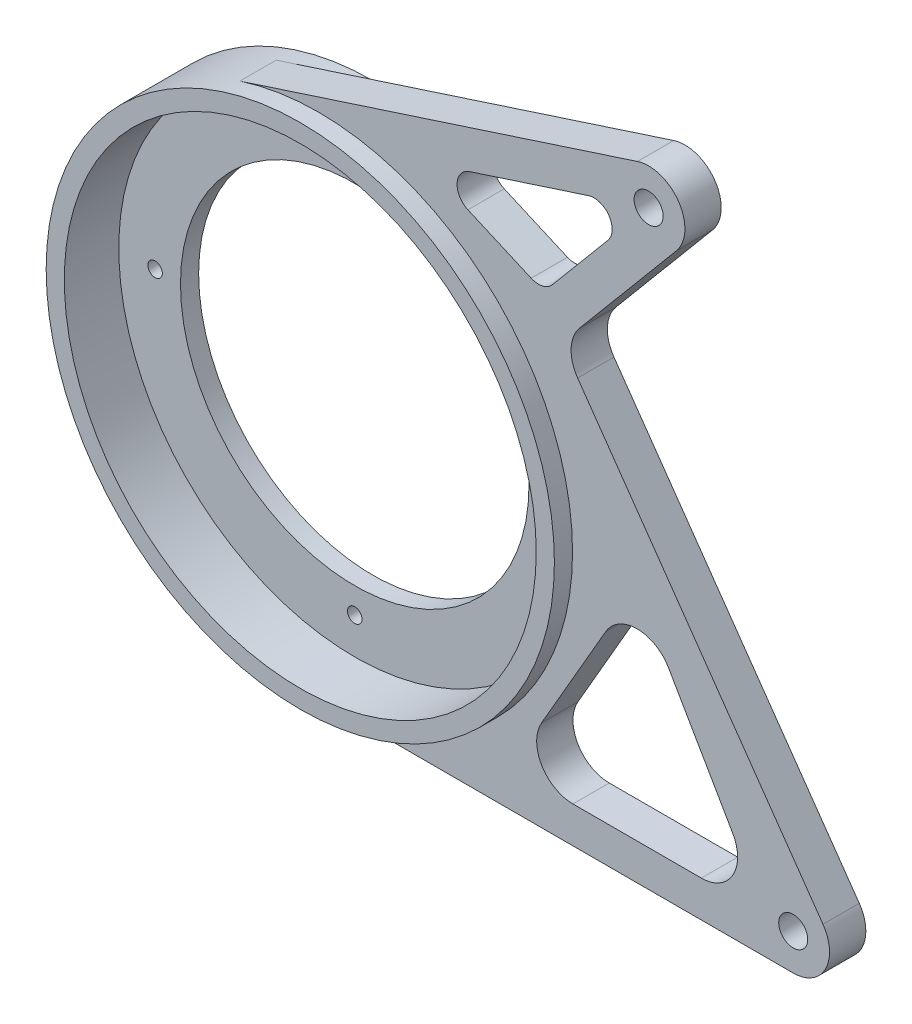
ISO-10303-21;
HEADER;
FILE_DESCRIPTION(('STEP AP214'),'2;1');
FILE_NAME('part.step','',(''),(''),'','','');
FILE_SCHEMA(('AUTOMOTIVE_DESIGN { 1 0 10303 214 1 1 1 1 }'));
ENDSEC;
DATA;
#1=APPLICATION_CONTEXT('core data for automotive mechanical design processes');
#2=APPLICATION_PROTOCOL_DEFINITION('international standard','automotive_design',2000,#1);
#3=PRODUCT_CONTEXT('',#1,'mechanical');
#4=PRODUCT('Part','Part','',(#3));
#5=PRODUCT_RELATED_PRODUCT_CATEGORY('part','',(#4));
#6=PRODUCT_DEFINITION_FORMATION('','',#4);
#7=PRODUCT_DEFINITION_CONTEXT('part definition',#1,'design');
#8=PRODUCT_DEFINITION('design','',#6,#7);
#9=PRODUCT_DEFINITION_SHAPE('','',#8);
#10=(LENGTH_UNIT() NAMED_UNIT(*) SI_UNIT(.MILLI.,.METRE.));
#11=(NAMED_UNIT(*) PLANE_ANGLE_UNIT() SI_UNIT($,.RADIAN.));
#12=(NAMED_UNIT(*) SI_UNIT($,.STERADIAN.) SOLID_ANGLE_UNIT());
#13=UNCERTAINTY_MEASURE_WITH_UNIT(LENGTH_MEASURE(1.E-05),#10,'distance_accuracy_value','');
#14=(GEOMETRIC_REPRESENTATION_CONTEXT(3) GLOBAL_UNCERTAINTY_ASSIGNED_CONTEXT((#13)) GLOBAL_UNIT_ASSIGNED_CONTEXT((#10,
#11,#12)) REPRESENTATION_CONTEXT('',''));
#15=CARTESIAN_POINT('',(0.,0.,0.));
#16=DIRECTION('',(0.,0.,1.));
#17=DIRECTION('',(1.,0.,0.));
#18=AXIS2_PLACEMENT_3D('',#15,#16,#17);
#19=CARTESIAN_POINT('',(15.4162789410525,-12.9357939735634,20.));
#20=DIRECTION('',(0.766044443118974,-0.642787609686544,0.));
#21=DIRECTION('',(0.642787609686544,0.766044443118974,0.));
#22=AXIS2_PLACEMENT_3D('',#19,#20,#21);
#23=PLANE('',#22);
#24=DIRECTION('',(0.,0.,-1.));
#25=VECTOR('',#24,1.);
#26=CARTESIAN_POINT('',(71.9311352964435,54.4159891229186,20.));
#27=LINE('',#26,#25);
#28=CARTESIAN_POINT('',(71.9311352964435,54.4159891229186,15.));
#29=VERTEX_POINT('',#28);
#30=CARTESIAN_POINT('',(71.9311352964435,54.4159891229186,5.));
#31=VERTEX_POINT('',#30);
#32=EDGE_CURVE('E229',#29,#31,#27,.T.);
#33=ORIENTED_EDGE('',*,*,#32,.T.);
#34=DIRECTION('',(0.642787609686544,0.766044443118974,0.));
#35=VECTOR('',#34,1.);
#36=CARTESIAN_POINT('',(15.4162789410525,-12.9357939735634,5.));
#37=LINE('',#36,#35);
#38=CARTESIAN_POINT('',(98.6106198945981,86.2113607413309,5.));
#39=VERTEX_POINT('',#38);
#40=EDGE_CURVE('E702',#31,#39,#37,.T.);
#41=ORIENTED_EDGE('',*,*,#40,.T.);
#42=DIRECTION('',(0.,0.,-1.));
#43=VECTOR('',#42,1.);
#44=CARTESIAN_POINT('',(98.6106198945981,86.2113607413309,20.));
#45=LINE('',#44,#43);
#46=CARTESIAN_POINT('',(98.6106198945981,86.2113607413309,15.));
#47=VERTEX_POINT('',#46);
#48=EDGE_CURVE('E206',#47,#39,#45,.T.);
#49=ORIENTED_EDGE('',*,*,#48,.F.);
#50=DIRECTION('',(-0.642787609686544,-0.766044443118974,0.));
#51=VECTOR('',#50,1.);
#52=CARTESIAN_POINT('',(15.4162789410525,-12.9357939735634,15.));
#53=LINE('',#52,#51);
#54=EDGE_CURVE('E655',#47,#29,#53,.T.);
#55=ORIENTED_EDGE('',*,*,#54,.T.);
#56=EDGE_LOOP('',(#33,#41,#49,#55));
#57=FACE_BOUND('',#56,.T.);
#58=ADVANCED_FACE('F35',(#57),#23,.T.);
#59=CARTESIAN_POINT('',(90.9501754634083,92.6392368381963,20.));
#60=DIRECTION('',(0.,0.,-1.));
#61=DIRECTION('',(-1.,0.,0.));
#62=AXIS2_PLACEMENT_3D('',#59,#60,#61);
#63=CYLINDRICAL_SURFACE('',#62,10.);
#64=CARTESIAN_POINT('',(90.9501754634083,92.6392368381963,5.));
#65=DIRECTION('',(0.,0.,-1.));
#66=DIRECTION('',(-1.,0.,0.));
#67=AXIS2_PLACEMENT_3D('',#64,#65,#66);
#68=CIRCLE('',#67,10.);
#69=CARTESIAN_POINT('',(87.8600055196588,102.149802001148,5.));
#70=VERTEX_POINT('',#69);
#71=EDGE_CURVE('E705',#70,#39,#68,.T.);
#72=ORIENTED_EDGE('',*,*,#71,.F.);
#73=DIRECTION('',(0.,0.,-1.));
#74=VECTOR('',#73,1.);
#75=CARTESIAN_POINT('',(87.8600055196588,102.149802001148,20.));
#76=LINE('',#75,#74);
#77=CARTESIAN_POINT('',(87.8600055196588,102.149802001148,15.));
#78=VERTEX_POINT('',#77);
#79=EDGE_CURVE('E198',#78,#70,#76,.T.);
#80=ORIENTED_EDGE('',*,*,#79,.F.);
#81=CARTESIAN_POINT('',(90.9501754634083,92.6392368381963,15.));
#82=DIRECTION('',(0.,0.,1.));
#83=DIRECTION('',(1.,0.,0.));
#84=AXIS2_PLACEMENT_3D('',#81,#82,#83);
#85=CIRCLE('',#84,10.);
#86=EDGE_CURVE('E651',#47,#78,#85,.T.);
#87=ORIENTED_EDGE('',*,*,#86,.F.);
#88=ORIENTED_EDGE('',*,*,#48,.T.);
#89=EDGE_LOOP('',(#72,#80,#87,#88));
#90=FACE_BOUND('',#89,.T.);
#91=ADVANCED_FACE('F311',(#90),#63,.T.);
#92=CARTESIAN_POINT('',(-21.6311896062464,66.5739561406608,20.));
#93=DIRECTION('',(-0.309016994374948,0.951056516295153,0.));
#94=DIRECTION('',(-0.951056516295153,-0.309016994374948,0.));
#95=AXIS2_PLACEMENT_3D('',#92,#93,#94);
#96=PLANE('',#95);
#97=ORIENTED_EDGE('',*,*,#79,.T.);
#98=DIRECTION('',(-0.951056516295153,-0.309016994374948,0.));
#99=VECTOR('',#98,1.);
#100=CARTESIAN_POINT('',(-21.6311896062464,66.5739561406608,5.));
#101=LINE('',#100,#99);
#102=CARTESIAN_POINT('',(-21.6311896062464,66.5739561406608,5.));
#103=VERTEX_POINT('',#102);
#104=EDGE_CURVE('E639',#70,#103,#101,.T.);
#105=ORIENTED_EDGE('',*,*,#104,.T.);
#106=DIRECTION('',(0.,0.,-1.));
#107=VECTOR('',#106,1.);
#108=CARTESIAN_POINT('',(-21.6311896062464,66.5739561406608,20.));
#109=LINE('',#108,#107);
#110=CARTESIAN_POINT('',(-21.6311896062464,66.5739561406608,15.));
#111=VERTEX_POINT('',#110);
#112=EDGE_CURVE('E191',#111,#103,#109,.T.);
#113=ORIENTED_EDGE('',*,*,#112,.F.);
#114=DIRECTION('',(-0.951056516295153,-0.309016994374949,0.));
#115=VECTOR('',#114,1.);
#116=CARTESIAN_POINT('',(-21.6311896062464,66.5739561406608,15.));
#117=LINE('',#116,#115);
#118=EDGE_CURVE('E737',#78,#111,#117,.T.);
#119=ORIENTED_EDGE('',*,*,#118,.F.);
#120=EDGE_LOOP('',(#97,#105,#113,#119));
#121=FACE_BOUND('',#120,.T.);
#122=ADVANCED_FACE('F317',(#121),#96,.T.);
#123=CARTESIAN_POINT('',(0.,-70.,20.));
#124=DIRECTION('',(0.,1.,0.));
#125=DIRECTION('',(0.,0.,1.));
#126=AXIS2_PLACEMENT_3D('',#123,#124,#125);
#127=PLANE('',#126);
#128=DIRECTION('',(-1.,0.,0.));
#129=VECTOR('',#128,1.);
#130=CARTESIAN_POINT('',(0.,-70.,5.));
#131=LINE('',#130,#129);
#132=CARTESIAN_POINT('',(130.790178730288,-70.,5.));
#133=VERTEX_POINT('',#132);
#134=CARTESIAN_POINT('',(0.,-70.,5.));
#135=VERTEX_POINT('',#134);
#136=EDGE_CURVE('E170',#133,#135,#131,.T.);
#137=ORIENTED_EDGE('',*,*,#136,.F.);
#138=DIRECTION('',(0.,0.,-1.));
#139=VECTOR('',#138,1.);
#140=CARTESIAN_POINT('',(130.790178730288,-70.,20.));
#141=LINE('',#140,#139);
#142=CARTESIAN_POINT('',(130.790178730288,-70.,15.));
#143=VERTEX_POINT('',#142);
#144=EDGE_CURVE('E196',#143,#133,#141,.T.);
#145=ORIENTED_EDGE('',*,*,#144,.F.);
#146=DIRECTION('',(1.,0.,0.));
#147=VECTOR('',#146,1.);
#148=CARTESIAN_POINT('',(175.711739026467,-70.,15.));
#149=LINE('',#148,#147);
#150=CARTESIAN_POINT('',(0.,-70.,15.));
#151=VERTEX_POINT('',#150);
#152=EDGE_CURVE('E195',#151,#143,#149,.T.);
#153=ORIENTED_EDGE('',*,*,#152,.F.);
#154=DIRECTION('',(0.,0.,-1.));
#155=VECTOR('',#154,1.);
#156=CARTESIAN_POINT('',(0.,-70.,20.));
#157=LINE('',#156,#155);
#158=EDGE_CURVE('E189',#151,#135,#157,.T.);
#159=ORIENTED_EDGE('',*,*,#158,.T.);
#160=EDGE_LOOP('',(#137,#145,#153,#159));
#161=FACE_BOUND('',#160,.T.);
#162=ADVANCED_FACE('F194',(#161),#127,.F.);
#163=CARTESIAN_POINT('',(130.790178730288,-60.,20.));
#164=DIRECTION('',(0.,0.,-1.));
#165=DIRECTION('',(-1.,0.,0.));
#166=AXIS2_PLACEMENT_3D('',#163,#164,#165);
#167=CYLINDRICAL_SURFACE('',#166,9.99999999999998);
#168=CARTESIAN_POINT('',(130.790178730288,-60.,5.));
#169=DIRECTION('',(0.,0.,-1.));
#170=DIRECTION('',(-1.,0.,0.));
#171=AXIS2_PLACEMENT_3D('',#168,#169,#170);
#172=CIRCLE('',#171,9.99999999999998);
#173=CARTESIAN_POINT('',(138.981699173178,-54.2642356364896,5.));
#174=VERTEX_POINT('',#173);
#175=EDGE_CURVE('E176',#174,#133,#172,.T.);
#176=ORIENTED_EDGE('',*,*,#175,.F.);
#177=DIRECTION('',(0.,0.,-1.));
#178=VECTOR('',#177,1.);
#179=CARTESIAN_POINT('',(138.981699173178,-54.2642356364896,20.));
#180=LINE('',#179,#178);
#181=CARTESIAN_POINT('',(138.981699173178,-54.2642356364896,15.));
#182=VERTEX_POINT('',#181);
#183=EDGE_CURVE('E200',#182,#174,#180,.T.);
#184=ORIENTED_EDGE('',*,*,#183,.F.);
#185=CARTESIAN_POINT('',(130.790178730288,-60.,15.));
#186=DIRECTION('',(0.,0.,1.));
#187=DIRECTION('',(1.,0.,0.));
#188=AXIS2_PLACEMENT_3D('',#185,#186,#187);
#189=CIRCLE('',#188,9.99999999999998);
#190=EDGE_CURVE('E701',#143,#182,#189,.T.);
#191=ORIENTED_EDGE('',*,*,#190,.F.);
#192=ORIENTED_EDGE('',*,*,#144,.T.);
#193=EDGE_LOOP('',(#176,#184,#191,#192));
#194=FACE_BOUND('',#193,.T.);
#195=ADVANCED_FACE('F497',(#194),#167,.T.);
#196=CARTESIAN_POINT('',(67.7622690219187,47.4476515753416,20.));
#197=DIRECTION('',(0.819152044288993,0.573576436351044,0.));
#198=DIRECTION('',(-0.573576436351044,0.819152044288993,0.));
#199=AXIS2_PLACEMENT_3D('',#196,#197,#198);
#200=PLANE('',#199);
#201=ORIENTED_EDGE('',*,*,#183,.T.);
#202=DIRECTION('',(-0.573576436351044,0.819152044288993,0.));
#203=VECTOR('',#202,1.);
#204=CARTESIAN_POINT('',(67.7622690219187,47.4476515753416,5.));
#205=LINE('',#204,#203);
#206=CARTESIAN_POINT('',(71.4000592847433,42.2523486625427,5.));
#207=VERTEX_POINT('',#206);
#208=EDGE_CURVE('E698',#174,#207,#205,.T.);
#209=ORIENTED_EDGE('',*,*,#208,.T.);
#210=DIRECTION('',(0.,0.,-1.));
#211=VECTOR('',#210,1.);
#212=CARTESIAN_POINT('',(71.4000592847433,42.2523486625427,20.));
#213=LINE('',#212,#211);
#214=CARTESIAN_POINT('',(71.4000592847433,42.2523486625427,15.));
#215=VERTEX_POINT('',#214);
#216=EDGE_CURVE('E691',#215,#207,#213,.T.);
#217=ORIENTED_EDGE('',*,*,#216,.F.);
#218=DIRECTION('',(0.573576436351044,-0.819152044288993,0.));
#219=VECTOR('',#218,1.);
#220=CARTESIAN_POINT('',(67.7622690219187,47.4476515753416,15.));
#221=LINE('',#220,#219);
#222=EDGE_CURVE('E699',#215,#182,#221,.T.);
#223=ORIENTED_EDGE('',*,*,#222,.T.);
#224=EDGE_LOOP('',(#201,#209,#217,#223));
#225=FACE_BOUND('',#224,.T.);
#226=ADVANCED_FACE('F356',(#225),#200,.T.);
#227=CARTESIAN_POINT('',(87.7901787302884,-19.3782217350898,20.));
#228=DIRECTION('',(0.,0.,-1.));
#229=DIRECTION('',(-1.,0.,0.));
#230=AXIS2_PLACEMENT_3D('',#227,#228,#229);
#231=CYLINDRICAL_SURFACE('',#230,9.99999999999999);
#232=DIRECTION('',(0.,0.,-1.));
#233=VECTOR('',#232,1.);
#234=CARTESIAN_POINT('',(79.129924692444,-14.3782217350898,20.));
#235=LINE('',#234,#233);
#236=CARTESIAN_POINT('',(79.129924692444,-14.3782217350898,15.));
#237=VERTEX_POINT('',#236);
#238=CARTESIAN_POINT('',(79.129924692444,-14.3782217350898,5.));
#239=VERTEX_POINT('',#238);
#240=EDGE_CURVE('E210',#237,#239,#235,.T.);
#241=ORIENTED_EDGE('',*,*,#240,.T.);
#242=CARTESIAN_POINT('',(87.7901787302884,-19.3782217350898,5.));
#243=DIRECTION('',(0.,0.,-1.));
#244=DIRECTION('',(-1.,0.,0.));
#245=AXIS2_PLACEMENT_3D('',#242,#243,#244);
#246=CIRCLE('',#245,9.99999999999999);
#247=CARTESIAN_POINT('',(96.4504327681327,-14.3782217350898,5.));
#248=VERTEX_POINT('',#247);
#249=EDGE_CURVE('E50',#239,#248,#246,.T.);
#250=ORIENTED_EDGE('',*,*,#249,.T.);
#251=DIRECTION('',(0.,0.,-1.));
#252=VECTOR('',#251,1.);
#253=CARTESIAN_POINT('',(96.4504327681327,-14.3782217350898,20.));
#254=LINE('',#253,#252);
#255=CARTESIAN_POINT('',(96.4504327681327,-14.3782217350898,15.));
#256=VERTEX_POINT('',#255);
#257=EDGE_CURVE('E226',#256,#248,#254,.T.);
#258=ORIENTED_EDGE('',*,*,#257,.F.);
#259=CARTESIAN_POINT('',(87.7901787302884,-19.3782217350898,15.));
#260=DIRECTION('',(0.,0.,1.));
#261=DIRECTION('',(1.,0.,0.));
#262=AXIS2_PLACEMENT_3D('',#259,#260,#261);
#263=CIRCLE('',#262,9.99999999999999);
#264=EDGE_CURVE('E682',#256,#237,#263,.T.);
#265=ORIENTED_EDGE('',*,*,#264,.T.);
#266=EDGE_LOOP('',(#241,#250,#258,#265));
#267=FACE_BOUND('',#266,.T.);
#268=ADVANCED_FACE('F352',(#267),#231,.F.);
#269=CARTESIAN_POINT('',(66.1118719341824,38.1697070578307,20.));
#270=DIRECTION('',(-0.866025403784436,-0.500000000000004,0.));
#271=DIRECTION('',(0.500000000000004,-0.866025403784436,0.));
#272=AXIS2_PLACEMENT_3D('',#269,#270,#271);
#273=PLANE('',#272);
#274=ORIENTED_EDGE('',*,*,#257,.T.);
#275=DIRECTION('',(0.500000000000004,-0.866025403784436,0.));
#276=VECTOR('',#275,1.);
#277=CARTESIAN_POINT('',(66.1118719341824,38.1697070578307,5.));
#278=LINE('',#277,#276);
#279=CARTESIAN_POINT('',(114.129924692444,-45.,5.));
#280=VERTEX_POINT('',#279);
#281=EDGE_CURVE('E728',#248,#280,#278,.T.);
#282=ORIENTED_EDGE('',*,*,#281,.T.);
#283=DIRECTION('',(0.,0.,-1.));
#284=VECTOR('',#283,1.);
#285=CARTESIAN_POINT('',(114.129924692444,-45.,20.));
#286=LINE('',#285,#284);
#287=CARTESIAN_POINT('',(114.129924692444,-45.,15.));
#288=VERTEX_POINT('',#287);
#289=EDGE_CURVE('E223',#288,#280,#286,.T.);
#290=ORIENTED_EDGE('',*,*,#289,.F.);
#291=DIRECTION('',(-0.500000000000004,0.866025403784436,0.));
#292=VECTOR('',#291,1.);
#293=CARTESIAN_POINT('',(66.1118719341824,38.1697070578307,15.));
#294=LINE('',#293,#292);
#295=EDGE_CURVE('E679',#288,#256,#294,.T.);
#296=ORIENTED_EDGE('',*,*,#295,.T.);
#297=EDGE_LOOP('',(#274,#282,#290,#296));
#298=FACE_BOUND('',#297,.T.);
#299=ADVANCED_FACE('F348',(#298),#273,.T.);
#300=CARTESIAN_POINT('',(105.469670654599,-50.,20.));
#301=DIRECTION('',(0.,0.,-1.));
#302=DIRECTION('',(-1.,0.,0.));
#303=AXIS2_PLACEMENT_3D('',#300,#301,#302);
#304=CYLINDRICAL_SURFACE('',#303,10.);
#305=ORIENTED_EDGE('',*,*,#289,.T.);
#306=CARTESIAN_POINT('',(105.469670654599,-50.,5.));
#307=DIRECTION('',(0.,0.,-1.));
#308=DIRECTION('',(-1.,0.,0.));
#309=AXIS2_PLACEMENT_3D('',#306,#307,#308);
#310=CIRCLE('',#309,10.);
#311=CARTESIAN_POINT('',(105.469670654599,-60.,5.));
#312=VERTEX_POINT('',#311);
#313=EDGE_CURVE('E725',#280,#312,#310,.T.);
#314=ORIENTED_EDGE('',*,*,#313,.T.);
#315=DIRECTION('',(0.,0.,-1.));
#316=VECTOR('',#315,1.);
#317=CARTESIAN_POINT('',(105.469670654599,-60.,20.));
#318=LINE('',#317,#316);
#319=CARTESIAN_POINT('',(105.469670654599,-60.,15.));
#320=VERTEX_POINT('',#319);
#321=EDGE_CURVE('E220',#320,#312,#318,.T.);
#322=ORIENTED_EDGE('',*,*,#321,.F.);
#323=CARTESIAN_POINT('',(105.469670654599,-50.,15.));
#324=DIRECTION('',(0.,0.,1.));
#325=DIRECTION('',(1.,0.,0.));
#326=AXIS2_PLACEMENT_3D('',#323,#324,#325);
#327=CIRCLE('',#326,10.);
#328=EDGE_CURVE('E676',#320,#288,#327,.T.);
#329=ORIENTED_EDGE('',*,*,#328,.T.);
#330=EDGE_LOOP('',(#305,#314,#322,#329));
#331=FACE_BOUND('',#330,.T.);
#332=ADVANCED_FACE('F344',(#331),#304,.F.);
#333=CARTESIAN_POINT('',(0.,-60.,20.));
#334=DIRECTION('',(0.,1.,0.));
#335=DIRECTION('',(-1.,0.,0.));
#336=AXIS2_PLACEMENT_3D('',#333,#334,#335);
#337=PLANE('',#336);
#338=ORIENTED_EDGE('',*,*,#321,.T.);
#339=DIRECTION('',(-1.,0.,0.));
#340=VECTOR('',#339,1.);
#341=CARTESIAN_POINT('',(0.,-60.,5.));
#342=LINE('',#341,#340);
#343=CARTESIAN_POINT('',(70.1106868059772,-60.,5.));
#344=VERTEX_POINT('',#343);
#345=EDGE_CURVE('E722',#312,#344,#342,.T.);
#346=ORIENTED_EDGE('',*,*,#345,.T.);
#347=DIRECTION('',(0.,0.,-1.));
#348=VECTOR('',#347,1.);
#349=CARTESIAN_POINT('',(70.1106868059772,-60.,20.));
#350=LINE('',#349,#348);
#351=CARTESIAN_POINT('',(70.1106868059772,-60.,15.));
#352=VERTEX_POINT('',#351);
#353=EDGE_CURVE('E217',#352,#344,#350,.T.);
#354=ORIENTED_EDGE('',*,*,#353,.F.);
#355=DIRECTION('',(1.,0.,0.));
#356=VECTOR('',#355,1.);
#357=CARTESIAN_POINT('',(0.,-60.,15.));
#358=LINE('',#357,#356);
#359=EDGE_CURVE('E673',#352,#320,#358,.T.);
#360=ORIENTED_EDGE('',*,*,#359,.T.);
#361=EDGE_LOOP('',(#338,#346,#354,#360));
#362=FACE_BOUND('',#361,.T.);
#363=ADVANCED_FACE('F340',(#362),#337,.T.);
#364=CARTESIAN_POINT('',(70.1106868059772,-50.,20.));
#365=DIRECTION('',(0.,0.,-1.));
#366=DIRECTION('',(-1.,0.,0.));
#367=AXIS2_PLACEMENT_3D('',#364,#365,#366);
#368=CYLINDRICAL_SURFACE('',#367,9.99999999999999);
#369=CARTESIAN_POINT('',(70.1106868059772,-50.,5.));
#370=DIRECTION('',(0.,0.,-1.));
#371=DIRECTION('',(-1.,0.,0.));
#372=AXIS2_PLACEMENT_3D('',#369,#370,#371);
#373=CIRCLE('',#372,9.99999999999999);
#374=CARTESIAN_POINT('',(61.4504327681329,-45.,5.));
#375=VERTEX_POINT('',#374);
#376=EDGE_CURVE('E720',#375,#344,#373,.F.);
#377=ORIENTED_EDGE('',*,*,#376,.F.);
#378=DIRECTION('',(0.,0.,-1.));
#379=VECTOR('',#378,1.);
#380=CARTESIAN_POINT('',(61.4504327681329,-45.,20.));
#381=LINE('',#380,#379);
#382=CARTESIAN_POINT('',(61.4504327681329,-45.,15.));
#383=VERTEX_POINT('',#382);
#384=EDGE_CURVE('E213',#383,#375,#381,.T.);
#385=ORIENTED_EDGE('',*,*,#384,.F.);
#386=CARTESIAN_POINT('',(70.1106868059772,-50.,15.));
#387=DIRECTION('',(0.,0.,1.));
#388=DIRECTION('',(1.,0.,0.));
#389=AXIS2_PLACEMENT_3D('',#386,#387,#388);
#390=CIRCLE('',#389,9.99999999999999);
#391=EDGE_CURVE('E671',#352,#383,#390,.F.);
#392=ORIENTED_EDGE('',*,*,#391,.F.);
#393=ORIENTED_EDGE('',*,*,#353,.T.);
#394=EDGE_LOOP('',(#377,#385,#392,#393));
#395=FACE_BOUND('',#394,.T.);
#396=ADVANCED_FACE('F336',(#395),#368,.F.);
#397=CARTESIAN_POINT('',(75.9116192760992,82.495602608843,20.));
#398=DIRECTION('',(0.,0.,-1.));
#399=DIRECTION('',(-1.,0.,0.));
#400=AXIS2_PLACEMENT_3D('',#397,#398,#399);
#401=CYLINDRICAL_SURFACE('',#400,5.);
#402=DIRECTION('',(0.,0.,-1.));
#403=VECTOR('',#402,1.);
#404=CARTESIAN_POINT('',(74.3665343042242,87.2508851903187,20.));
#405=LINE('',#404,#403);
#406=CARTESIAN_POINT('',(74.3665343042242,87.2508851903187,15.));
#407=VERTEX_POINT('',#406);
#408=CARTESIAN_POINT('',(74.3665343042242,87.2508851903187,5.));
#409=VERTEX_POINT('',#408);
#410=EDGE_CURVE('E230',#407,#409,#405,.T.);
#411=ORIENTED_EDGE('',*,*,#410,.T.);
#412=CARTESIAN_POINT('',(75.9116192760992,82.495602608843,5.));
#413=DIRECTION('',(0.,0.,-1.));
#414=DIRECTION('',(-1.,0.,0.));
#415=AXIS2_PLACEMENT_3D('',#412,#413,#414);
#416=CIRCLE('',#415,5.);
#417=CARTESIAN_POINT('',(79.7418414916939,79.2816645604101,5.));
#418=VERTEX_POINT('',#417);
#419=EDGE_CURVE('E58',#409,#418,#416,.T.);
#420=ORIENTED_EDGE('',*,*,#419,.T.);
#421=DIRECTION('',(0.,0.,-1.));
#422=VECTOR('',#421,1.);
#423=CARTESIAN_POINT('',(79.7418414916939,79.2816645604101,20.));
#424=LINE('',#423,#422);
#425=CARTESIAN_POINT('',(79.7418414916939,79.2816645604101,15.));
#426=VERTEX_POINT('',#425);
#427=EDGE_CURVE('E214',#426,#418,#424,.T.);
#428=ORIENTED_EDGE('',*,*,#427,.F.);
#429=CARTESIAN_POINT('',(75.9116192760992,82.495602608843,15.));
#430=DIRECTION('',(0.,0.,1.));
#431=DIRECTION('',(1.,0.,0.));
#432=AXIS2_PLACEMENT_3D('',#429,#430,#431);
#433=CIRCLE('',#432,5.);
#434=EDGE_CURVE('E666',#426,#407,#433,.T.);
#435=ORIENTED_EDGE('',*,*,#434,.T.);
#436=EDGE_LOOP('',(#411,#420,#428,#435));
#437=FACE_BOUND('',#436,.T.);
#438=ADVANCED_FACE('F339',(#437),#401,.F.);
#439=CARTESIAN_POINT('',(7.75583450986284,-6.507917876698,20.));
#440=DIRECTION('',(-0.766044443118975,0.642787609686543,0.));
#441=DIRECTION('',(-0.642787609686543,-0.766044443118975,0.));
#442=AXIS2_PLACEMENT_3D('',#439,#440,#441);
#443=PLANE('',#442);
#444=ORIENTED_EDGE('',*,*,#427,.T.);
#445=DIRECTION('',(-0.642787609686543,-0.766044443118975,0.));
#446=VECTOR('',#445,1.);
#447=CARTESIAN_POINT('',(7.75583450986284,-6.507917876698,5.));
#448=LINE('',#447,#446);
#449=CARTESIAN_POINT('',(64.4300381277384,61.0337678923202,5.));
#450=VERTEX_POINT('',#449);
#451=EDGE_CURVE('E715',#418,#450,#448,.T.);
#452=ORIENTED_EDGE('',*,*,#451,.T.);
#453=DIRECTION('',(0.,0.,-1.));
#454=VECTOR('',#453,1.);
#455=CARTESIAN_POINT('',(64.4300381277384,61.0337678923202,20.));
#456=LINE('',#455,#454);
#457=CARTESIAN_POINT('',(64.4300381277384,61.0337678923202,15.));
#458=VERTEX_POINT('',#457);
#459=EDGE_CURVE('E243',#458,#450,#456,.T.);
#460=ORIENTED_EDGE('',*,*,#459,.F.);
#461=DIRECTION('',(0.642787609686543,0.766044443118975,0.));
#462=VECTOR('',#461,1.);
#463=CARTESIAN_POINT('',(7.75583450986284,-6.507917876698,15.));
#464=LINE('',#463,#462);
#465=EDGE_CURVE('E663',#458,#426,#464,.T.);
#466=ORIENTED_EDGE('',*,*,#465,.T.);
#467=EDGE_LOOP('',(#444,#452,#460,#466));
#468=FACE_BOUND('',#467,.T.);
#469=ADVANCED_FACE('F371',(#468),#443,.T.);
#470=CARTESIAN_POINT('',(60.5998159121435,64.2477059407529,20.));
#471=DIRECTION('',(0.,0.,-1.));
#472=DIRECTION('',(-1.,0.,0.));
#473=AXIS2_PLACEMENT_3D('',#470,#471,#472);
#474=CYLINDRICAL_SURFACE('',#473,5.);
#475=CARTESIAN_POINT('',(60.5998159121435,64.2477059407529,5.));
#476=DIRECTION('',(0.,0.,-1.));
#477=DIRECTION('',(-1.,0.,0.));
#478=AXIS2_PLACEMENT_3D('',#475,#476,#477);
#479=CIRCLE('',#478,5.);
#480=CARTESIAN_POINT('',(58.5962937630963,59.6666690495811,5.));
#481=VERTEX_POINT('',#480);
#482=EDGE_CURVE('E713',#481,#450,#479,.F.);
#483=ORIENTED_EDGE('',*,*,#482,.F.);
#484=DIRECTION('',(0.,0.,-1.));
#485=VECTOR('',#484,1.);
#486=CARTESIAN_POINT('',(58.5962937630963,59.6666690495811,20.));
#487=LINE('',#486,#485);
#488=CARTESIAN_POINT('',(58.5962937630963,59.6666690495811,15.));
#489=VERTEX_POINT('',#488);
#490=EDGE_CURVE('E240',#489,#481,#487,.T.);
#491=ORIENTED_EDGE('',*,*,#490,.F.);
#492=CARTESIAN_POINT('',(60.5998159121435,64.2477059407529,15.));
#493=DIRECTION('',(0.,0.,1.));
#494=DIRECTION('',(1.,0.,0.));
#495=AXIS2_PLACEMENT_3D('',#492,#493,#494);
#496=CIRCLE('',#495,5.);
#497=EDGE_CURVE('E661',#458,#489,#496,.F.);
#498=ORIENTED_EDGE('',*,*,#497,.F.);
#499=ORIENTED_EDGE('',*,*,#459,.T.);
#500=EDGE_LOOP('',(#483,#491,#498,#499));
#501=FACE_BOUND('',#500,.T.);
#502=ADVANCED_FACE('F367',(#501),#474,.F.);
#503=CARTESIAN_POINT('',(31.3137837210976,71.5987085527085,20.));
#504=DIRECTION('',(0.400704429809434,0.916207378234369,0.));
#505=DIRECTION('',(-0.916207378234369,0.400704429809434,0.));
#506=AXIS2_PLACEMENT_3D('',#503,#504,#505);
#507=PLANE('',#506);
#508=ORIENTED_EDGE('',*,*,#490,.T.);
#509=DIRECTION('',(-0.916207378234369,0.400704429809434,0.));
#510=VECTOR('',#509,1.);
#511=CARTESIAN_POINT('',(31.3137837210976,71.5987085527085,5.));
#512=LINE('',#511,#510);
#513=CARTESIAN_POINT('',(41.1841249404004,67.2819026152501,5.));
#514=VERTEX_POINT('',#513);
#515=EDGE_CURVE('E644',#481,#514,#512,.T.);
#516=ORIENTED_EDGE('',*,*,#515,.T.);
#517=DIRECTION('',(0.,0.,-1.));
#518=VECTOR('',#517,1.);
#519=CARTESIAN_POINT('',(41.1841249404004,67.2819026152501,20.));
#520=LINE('',#519,#518);
#521=CARTESIAN_POINT('',(41.1841249404004,67.2819026152501,15.));
#522=VERTEX_POINT('',#521);
#523=EDGE_CURVE('E237',#522,#514,#520,.T.);
#524=ORIENTED_EDGE('',*,*,#523,.F.);
#525=DIRECTION('',(0.916207378234369,-0.400704429809434,0.));
#526=VECTOR('',#525,1.);
#527=CARTESIAN_POINT('',(31.3137837210976,71.5987085527085,15.));
#528=LINE('',#527,#526);
#529=EDGE_CURVE('E653',#522,#489,#528,.T.);
#530=ORIENTED_EDGE('',*,*,#529,.T.);
#531=EDGE_LOOP('',(#508,#516,#524,#530));
#532=FACE_BOUND('',#531,.T.);
#533=ADVANCED_FACE('F363',(#532),#507,.T.);
#534=CARTESIAN_POINT('',(43.1876470894474,71.862939506422,20.));
#535=DIRECTION('',(0.,0.,-1.));
#536=DIRECTION('',(-1.,0.,0.));
#537=AXIS2_PLACEMENT_3D('',#534,#535,#536);
#538=CYLINDRICAL_SURFACE('',#537,5.);
#539=CARTESIAN_POINT('',(43.1876470894474,71.862939506422,5.));
#540=DIRECTION('',(0.,0.,-1.));
#541=DIRECTION('',(-1.,0.,0.));
#542=AXIS2_PLACEMENT_3D('',#539,#540,#541);
#543=CIRCLE('',#542,5.);
#544=CARTESIAN_POINT('',(41.6425621175728,76.6182220878978,5.));
#545=VERTEX_POINT('',#544);
#546=EDGE_CURVE('E636',#545,#514,#543,.F.);
#547=ORIENTED_EDGE('',*,*,#546,.F.);
#548=DIRECTION('',(0.,0.,-1.));
#549=VECTOR('',#548,1.);
#550=CARTESIAN_POINT('',(41.6425621175728,76.6182220878978,20.));
#551=LINE('',#550,#549);
#552=CARTESIAN_POINT('',(41.6425621175728,76.6182220878978,15.));
#553=VERTEX_POINT('',#552);
#554=EDGE_CURVE('E233',#553,#545,#551,.T.);
#555=ORIENTED_EDGE('',*,*,#554,.F.);
#556=CARTESIAN_POINT('',(43.1876470894474,71.862939506422,15.));
#557=DIRECTION('',(0.,0.,1.));
#558=DIRECTION('',(1.,0.,0.));
#559=AXIS2_PLACEMENT_3D('',#556,#557,#558);
#560=CIRCLE('',#559,5.);
#561=EDGE_CURVE('E650',#522,#553,#560,.F.);
#562=ORIENTED_EDGE('',*,*,#561,.F.);
#563=ORIENTED_EDGE('',*,*,#523,.T.);
#564=EDGE_LOOP('',(#547,#555,#562,#563));
#565=FACE_BOUND('',#564,.T.);
#566=ADVANCED_FACE('F327',(#565),#538,.F.);
#567=CARTESIAN_POINT('',(90.9501754634083,92.6392368381963,20.));
#568=DIRECTION('',(0.,0.,-1.));
#569=DIRECTION('',(-1.,0.,0.));
#570=AXIS2_PLACEMENT_3D('',#567,#568,#569);
#571=CYLINDRICAL_SURFACE('',#570,4.00000000000001);
#572=CARTESIAN_POINT('',(90.9501754634083,92.6392368381963,15.));
#573=DIRECTION('',(0.,0.,1.));
#574=DIRECTION('',(1.,0.,0.));
#575=AXIS2_PLACEMENT_3D('',#572,#573,#574);
#576=CIRCLE('',#575,4.00000000000001);
#577=CARTESIAN_POINT('',(94.9501754634083,92.6392368381963,15.));
#578=VERTEX_POINT('',#577);
#579=EDGE_CURVE('E234',#578,#578,#576,.T.);
#580=ORIENTED_EDGE('',*,*,#579,.T.);
#581=EDGE_LOOP('',(#580));
#582=FACE_BOUND('',#581,.T.);
#583=CARTESIAN_POINT('',(90.9501754634083,92.6392368381963,5.));
#584=DIRECTION('',(0.,0.,-1.));
#585=DIRECTION('',(-1.,0.,0.));
#586=AXIS2_PLACEMENT_3D('',#583,#584,#585);
#587=CIRCLE('',#586,4.00000000000001);
#588=CARTESIAN_POINT('',(86.9501754634083,92.6392368381963,5.));
#589=VERTEX_POINT('',#588);
#590=EDGE_CURVE('E628',#589,#589,#587,.T.);
#591=ORIENTED_EDGE('',*,*,#590,.T.);
#592=EDGE_LOOP('',(#591));
#593=FACE_BOUND('',#592,.T.);
#594=ADVANCED_FACE('F323',(#582,#593),#571,.F.);
#595=CARTESIAN_POINT('',(130.790178730288,-60.,20.));
#596=DIRECTION('',(0.,0.,-1.));
#597=DIRECTION('',(-1.,0.,0.));
#598=AXIS2_PLACEMENT_3D('',#595,#596,#597);
#599=CYLINDRICAL_SURFACE('',#598,3.99999999999999);
#600=CARTESIAN_POINT('',(130.790178730288,-60.,15.));
#601=DIRECTION('',(0.,0.,1.));
#602=DIRECTION('',(1.,0.,0.));
#603=AXIS2_PLACEMENT_3D('',#600,#601,#602);
#604=CIRCLE('',#603,3.99999999999999);
#605=CARTESIAN_POINT('',(134.790178730288,-60.,15.));
#606=VERTEX_POINT('',#605);
#607=EDGE_CURVE('E685',#606,#606,#604,.T.);
#608=ORIENTED_EDGE('',*,*,#607,.T.);
#609=EDGE_LOOP('',(#608));
#610=FACE_BOUND('',#609,.T.);
#611=CARTESIAN_POINT('',(130.790178730288,-60.,5.));
#612=DIRECTION('',(0.,0.,-1.));
#613=DIRECTION('',(-1.,0.,0.));
#614=AXIS2_PLACEMENT_3D('',#611,#612,#613);
#615=CIRCLE('',#614,3.99999999999999);
#616=CARTESIAN_POINT('',(126.790178730288,-60.,5.));
#617=VERTEX_POINT('',#616);
#618=EDGE_CURVE('E631',#617,#617,#615,.T.);
#619=ORIENTED_EDGE('',*,*,#618,.T.);
#620=EDGE_LOOP('',(#619));
#621=FACE_BOUND('',#620,.T.);
#622=ADVANCED_FACE('F326',(#610,#621),#599,.F.);
#623=CARTESIAN_POINT('',(65.5733961612494,-37.8588179253757,20.));
#624=DIRECTION('',(0.866025403784437,-0.500000000000004,0.));
#625=DIRECTION('',(0.500000000000004,0.866025403784437,0.));
#626=AXIS2_PLACEMENT_3D('',#623,#624,#625);
#627=PLANE('',#626);
#628=ORIENTED_EDGE('',*,*,#384,.T.);
#629=DIRECTION('',(0.500000000000004,0.866025403784437,0.));
#630=VECTOR('',#629,1.);
#631=CARTESIAN_POINT('',(65.5733961612494,-37.8588179253757,5.));
#632=LINE('',#631,#630);
#633=EDGE_CURVE('E632',#375,#239,#632,.T.);
#634=ORIENTED_EDGE('',*,*,#633,.T.);
#635=ORIENTED_EDGE('',*,*,#240,.F.);
#636=DIRECTION('',(-0.500000000000004,-0.866025403784437,0.));
#637=VECTOR('',#636,1.);
#638=CARTESIAN_POINT('',(65.5733961612494,-37.8588179253757,15.));
#639=LINE('',#638,#637);
#640=EDGE_CURVE('E668',#237,#383,#639,.T.);
#641=ORIENTED_EDGE('',*,*,#640,.T.);
#642=EDGE_LOOP('',(#628,#634,#635,#641));
#643=FACE_BOUND('',#642,.T.);
#644=ADVANCED_FACE('F331',(#643),#627,.T.);
#645=CARTESIAN_POINT('',(-18.5410196624969,57.0633909777092,20.));
#646=DIRECTION('',(0.309016994374949,-0.951056516295153,0.));
#647=DIRECTION('',(0.951056516295153,0.309016994374949,0.));
#648=AXIS2_PLACEMENT_3D('',#645,#646,#647);
#649=PLANE('',#648);
#650=ORIENTED_EDGE('',*,*,#554,.T.);
#651=DIRECTION('',(0.951056516295153,0.309016994374949,0.));
#652=VECTOR('',#651,1.);
#653=CARTESIAN_POINT('',(-18.5410196624969,57.0633909777092,5.));
#654=LINE('',#653,#652);
#655=EDGE_CURVE('E634',#545,#409,#654,.T.);
#656=ORIENTED_EDGE('',*,*,#655,.T.);
#657=ORIENTED_EDGE('',*,*,#410,.F.);
#658=DIRECTION('',(-0.951056516295153,-0.309016994374949,0.));
#659=VECTOR('',#658,1.);
#660=CARTESIAN_POINT('',(-18.5410196624969,57.0633909777092,15.));
#661=LINE('',#660,#659);
#662=EDGE_CURVE('E647',#407,#553,#661,.T.);
#663=ORIENTED_EDGE('',*,*,#662,.T.);
#664=EDGE_LOOP('',(#650,#656,#657,#663));
#665=FACE_BOUND('',#664,.T.);
#666=ADVANCED_FACE('F303',(#665),#649,.T.);
#667=CARTESIAN_POINT('',(79.5915797276332,47.9881130260532,20.));
#668=DIRECTION('',(0.,0.,-1.));
#669=DIRECTION('',(-1.,0.,0.));
#670=AXIS2_PLACEMENT_3D('',#667,#668,#669);
#671=CYLINDRICAL_SURFACE('',#670,10.);
#672=CARTESIAN_POINT('',(79.5915797276332,47.9881130260532,5.));
#673=DIRECTION('',(0.,0.,-1.));
#674=DIRECTION('',(-1.,0.,0.));
#675=AXIS2_PLACEMENT_3D('',#672,#673,#674);
#676=CIRCLE('',#675,10.);
#677=EDGE_CURVE('E181',#31,#207,#676,.F.);
#678=ORIENTED_EDGE('',*,*,#677,.F.);
#679=ORIENTED_EDGE('',*,*,#32,.F.);
#680=CARTESIAN_POINT('',(79.5915797276332,47.9881130260532,15.));
#681=DIRECTION('',(0.,0.,1.));
#682=DIRECTION('',(1.,0.,0.));
#683=AXIS2_PLACEMENT_3D('',#680,#681,#682);
#684=CIRCLE('',#683,10.);
#685=EDGE_CURVE('E11',#215,#29,#684,.F.);
#686=ORIENTED_EDGE('',*,*,#685,.F.);
#687=ORIENTED_EDGE('',*,*,#216,.T.);
#688=EDGE_LOOP('',(#678,#679,#686,#687));
#689=FACE_BOUND('',#688,.T.);
#690=ADVANCED_FACE('F293',(#689),#671,.F.);
#691=CARTESIAN_POINT('',(0.,0.,5.));
#692=DIRECTION('',(0.,0.,1.));
#693=DIRECTION('',(1.,0.,0.));
#694=AXIS2_PLACEMENT_3D('',#691,#692,#693);
#695=PLANE('',#694);
#696=CARTESIAN_POINT('',(0.,0.,5.));
#697=DIRECTION('',(0.,0.,1.));
#698=DIRECTION('',(1.,0.,0.));
#699=AXIS2_PLACEMENT_3D('',#696,#697,#698);
#700=CIRCLE('',#699,48.);
#701=CARTESIAN_POINT('',(48.,0.,5.));
#702=VERTEX_POINT('',#701);
#703=EDGE_CURVE('E267',#702,#702,#700,.T.);
#704=ORIENTED_EDGE('',*,*,#703,.F.);
#705=EDGE_LOOP('',(#704));
#706=FACE_BOUND('',#705,.T.);
#707=CARTESIAN_POINT('',(55.,0.,5.));
#708=DIRECTION('',(0.,0.,1.));
#709=DIRECTION('',(1.,0.,0.));
#710=AXIS2_PLACEMENT_3D('',#707,#708,#709);
#711=CIRCLE('',#710,2.);
#712=CARTESIAN_POINT('',(57.,0.,5.));
#713=VERTEX_POINT('',#712);
#714=EDGE_CURVE('E264',#713,#713,#711,.T.);
#715=ORIENTED_EDGE('',*,*,#714,.F.);
#716=EDGE_LOOP('',(#715));
#717=FACE_BOUND('',#716,.T.);
#718=CARTESIAN_POINT('',(-9.78384040450919E-13,-55.,5.));
#719=DIRECTION('',(0.,0.,1.));
#720=DIRECTION('',(1.,0.,0.));
#721=AXIS2_PLACEMENT_3D('',#718,#719,#720);
#722=CIRCLE('',#721,2.00000000000001);
#723=CARTESIAN_POINT('',(1.99999999999903,-55.,5.));
#724=VERTEX_POINT('',#723);
#725=EDGE_CURVE('E261',#724,#724,#722,.T.);
#726=ORIENTED_EDGE('',*,*,#725,.F.);
#727=EDGE_LOOP('',(#726));
#728=FACE_BOUND('',#727,.T.);
#729=CARTESIAN_POINT('',(-55.,1.14838694109665E-12,5.));
#730=DIRECTION('',(0.,0.,1.));
#731=DIRECTION('',(1.,0.,0.));
#732=AXIS2_PLACEMENT_3D('',#729,#730,#731);
#733=CIRCLE('',#732,2.);
#734=CARTESIAN_POINT('',(-53.,1.14838694109665E-12,5.));
#735=VERTEX_POINT('',#734);
#736=EDGE_CURVE('E257',#735,#735,#733,.T.);
#737=ORIENTED_EDGE('',*,*,#736,.F.);
#738=EDGE_LOOP('',(#737));
#739=FACE_BOUND('',#738,.T.);
#740=CARTESIAN_POINT('',(1.34961486430996E-12,55.,5.));
#741=DIRECTION('',(0.,0.,1.));
#742=DIRECTION('',(1.,0.,0.));
#743=AXIS2_PLACEMENT_3D('',#740,#741,#742);
#744=CIRCLE('',#743,2.);
#745=CARTESIAN_POINT('',(2.00000000000135,55.,5.));
#746=VERTEX_POINT('',#745);
#747=EDGE_CURVE('E254',#746,#746,#744,.T.);
#748=ORIENTED_EDGE('',*,*,#747,.F.);
#749=EDGE_LOOP('',(#748));
#750=FACE_BOUND('',#749,.T.);
#751=CARTESIAN_POINT('',(0.,0.,5.));
#752=DIRECTION('',(0.,0.,1.));
#753=DIRECTION('',(1.,0.,0.));
#754=AXIS2_PLACEMENT_3D('',#751,#752,#753);
#755=CIRCLE('',#754,65.);
#756=CARTESIAN_POINT('',(65.,0.,5.));
#757=VERTEX_POINT('',#756);
#758=EDGE_CURVE('E43',#757,#757,#755,.F.);
#759=ORIENTED_EDGE('',*,*,#758,.F.);
#760=EDGE_LOOP('',(#759));
#761=FACE_BOUND('',#760,.T.);
#762=ADVANCED_FACE('F290',(#706,#717,#728,#739,#750,#761),#695,.T.);
#763=CARTESIAN_POINT('',(0.,0.,5.));
#764=DIRECTION('',(0.,0.,-1.));
#765=DIRECTION('',(-1.,0.,0.));
#766=AXIS2_PLACEMENT_3D('',#763,#764,#765);
#767=CYLINDRICAL_SURFACE('',#766,48.);
#768=ORIENTED_EDGE('',*,*,#703,.T.);
#769=EDGE_LOOP('',(#768));
#770=FACE_BOUND('',#769,.T.);
#771=CARTESIAN_POINT('',(0.,0.,0.));
#772=DIRECTION('',(0.,0.,1.));
#773=DIRECTION('',(1.,0.,0.));
#774=AXIS2_PLACEMENT_3D('',#771,#772,#773);
#775=CIRCLE('',#774,48.);
#776=CARTESIAN_POINT('',(48.,0.,0.));
#777=VERTEX_POINT('',#776);
#778=EDGE_CURVE('E281',#777,#777,#775,.T.);
#779=ORIENTED_EDGE('',*,*,#778,.F.);
#780=EDGE_LOOP('',(#779));
#781=FACE_BOUND('',#780,.T.);
#782=ADVANCED_FACE('F292',(#770,#781),#767,.F.);
#783=CARTESIAN_POINT('',(55.,0.,5.));
#784=DIRECTION('',(0.,0.,-1.));
#785=DIRECTION('',(-1.,0.,0.));
#786=AXIS2_PLACEMENT_3D('',#783,#784,#785);
#787=CYLINDRICAL_SURFACE('',#786,2.);
#788=ORIENTED_EDGE('',*,*,#714,.T.);
#789=EDGE_LOOP('',(#788));
#790=FACE_BOUND('',#789,.T.);
#791=CARTESIAN_POINT('',(55.,0.,0.));
#792=DIRECTION('',(0.,0.,1.));
#793=DIRECTION('',(1.,0.,0.));
#794=AXIS2_PLACEMENT_3D('',#791,#792,#793);
#795=CIRCLE('',#794,2.);
#796=CARTESIAN_POINT('',(57.,0.,0.));
#797=VERTEX_POINT('',#796);
#798=EDGE_CURVE('E278',#797,#797,#795,.T.);
#799=ORIENTED_EDGE('',*,*,#798,.F.);
#800=EDGE_LOOP('',(#799));
#801=FACE_BOUND('',#800,.T.);
#802=ADVANCED_FACE('F300',(#790,#801),#787,.F.);
#803=CARTESIAN_POINT('',(-9.78384040450919E-13,-55.,5.));
#804=DIRECTION('',(0.,0.,-1.));
#805=DIRECTION('',(-1.,0.,0.));
#806=AXIS2_PLACEMENT_3D('',#803,#804,#805);
#807=CYLINDRICAL_SURFACE('',#806,2.00000000000001);
#808=ORIENTED_EDGE('',*,*,#725,.T.);
#809=EDGE_LOOP('',(#808));
#810=FACE_BOUND('',#809,.T.);
#811=CARTESIAN_POINT('',(-9.78384040450919E-13,-55.,0.));
#812=DIRECTION('',(0.,0.,1.));
#813=DIRECTION('',(1.,0.,0.));
#814=AXIS2_PLACEMENT_3D('',#811,#812,#813);
#815=CIRCLE('',#814,2.00000000000001);
#816=CARTESIAN_POINT('',(1.99999999999903,-55.,0.));
#817=VERTEX_POINT('',#816);
#818=EDGE_CURVE('E275',#817,#817,#815,.T.);
#819=ORIENTED_EDGE('',*,*,#818,.F.);
#820=EDGE_LOOP('',(#819));
#821=FACE_BOUND('',#820,.T.);
#822=ADVANCED_FACE('F404',(#810,#821),#807,.F.);
#823=CARTESIAN_POINT('',(-55.,1.14838694109665E-12,5.));
#824=DIRECTION('',(0.,0.,-1.));
#825=DIRECTION('',(-1.,0.,0.));
#826=AXIS2_PLACEMENT_3D('',#823,#824,#825);
#827=CYLINDRICAL_SURFACE('',#826,2.);
#828=ORIENTED_EDGE('',*,*,#736,.T.);
#829=EDGE_LOOP('',(#828));
#830=FACE_BOUND('',#829,.T.);
#831=CARTESIAN_POINT('',(-55.,1.14838694109665E-12,0.));
#832=DIRECTION('',(0.,0.,1.));
#833=DIRECTION('',(1.,0.,0.));
#834=AXIS2_PLACEMENT_3D('',#831,#832,#833);
#835=CIRCLE('',#834,2.);
#836=CARTESIAN_POINT('',(-53.,1.14838694109665E-12,0.));
#837=VERTEX_POINT('',#836);
#838=EDGE_CURVE('E272',#837,#837,#835,.T.);
#839=ORIENTED_EDGE('',*,*,#838,.F.);
#840=EDGE_LOOP('',(#839));
#841=FACE_BOUND('',#840,.T.);
#842=ADVANCED_FACE('F399',(#830,#841),#827,.F.);
#843=CARTESIAN_POINT('',(1.34961486430996E-12,55.,5.));
#844=DIRECTION('',(0.,0.,-1.));
#845=DIRECTION('',(-1.,0.,0.));
#846=AXIS2_PLACEMENT_3D('',#843,#844,#845);
#847=CYLINDRICAL_SURFACE('',#846,2.);
#848=ORIENTED_EDGE('',*,*,#747,.T.);
#849=EDGE_LOOP('',(#848));
#850=FACE_BOUND('',#849,.T.);
#851=CARTESIAN_POINT('',(1.34961486430996E-12,55.,0.));
#852=DIRECTION('',(0.,0.,1.));
#853=DIRECTION('',(1.,0.,0.));
#854=AXIS2_PLACEMENT_3D('',#851,#852,#853);
#855=CIRCLE('',#854,2.);
#856=CARTESIAN_POINT('',(2.00000000000135,55.,0.));
#857=VERTEX_POINT('',#856);
#858=EDGE_CURVE('E253',#857,#857,#855,.T.);
#859=ORIENTED_EDGE('',*,*,#858,.F.);
#860=EDGE_LOOP('',(#859));
#861=FACE_BOUND('',#860,.T.);
#862=ADVANCED_FACE('F37',(#850,#861),#847,.F.);
#863=CARTESIAN_POINT('',(0.,0.,5.));
#864=DIRECTION('',(0.,0.,-1.));
#865=DIRECTION('',(-1.,0.,0.));
#866=AXIS2_PLACEMENT_3D('',#863,#864,#865);
#867=CYLINDRICAL_SURFACE('',#866,70.);
#868=ORIENTED_EDGE('',*,*,#112,.T.);
#869=CARTESIAN_POINT('',(0.,0.,5.));
#870=DIRECTION('',(0.,0.,1.));
#871=DIRECTION('',(-1.,0.,0.));
#872=AXIS2_PLACEMENT_3D('',#869,#870,#871);
#873=CIRCLE('',#872,70.);
#874=EDGE_CURVE('E173',#135,#103,#873,.T.);
#875=ORIENTED_EDGE('',*,*,#874,.F.);
#876=ORIENTED_EDGE('',*,*,#158,.F.);
#877=CARTESIAN_POINT('',(0.,0.,15.));
#878=DIRECTION('',(0.,0.,-1.));
#879=DIRECTION('',(1.,0.,0.));
#880=AXIS2_PLACEMENT_3D('',#877,#878,#879);
#881=CIRCLE('',#880,70.);
#882=EDGE_CURVE('E734',#111,#151,#881,.T.);
#883=ORIENTED_EDGE('',*,*,#882,.F.);
#884=EDGE_LOOP('',(#868,#875,#876,#883));
#885=FACE_BOUND('',#884,.T.);
#886=CARTESIAN_POINT('',(0.,0.,0.));
#887=DIRECTION('',(0.,0.,1.));
#888=DIRECTION('',(1.,0.,0.));
#889=AXIS2_PLACEMENT_3D('',#886,#887,#888);
#890=CIRCLE('',#889,70.);
#891=CARTESIAN_POINT('',(70.,0.,0.));
#892=VERTEX_POINT('',#891);
#893=EDGE_CURVE('E258',#892,#892,#890,.T.);
#894=ORIENTED_EDGE('',*,*,#893,.T.);
#895=EDGE_LOOP('',(#894));
#896=FACE_BOUND('',#895,.T.);
#897=CARTESIAN_POINT('',(0.,0.,20.));
#898=DIRECTION('',(0.,0.,1.));
#899=DIRECTION('',(1.,0.,0.));
#900=AXIS2_PLACEMENT_3D('',#897,#898,#899);
#901=CIRCLE('',#900,70.);
#902=CARTESIAN_POINT('',(70.,0.,20.));
#903=VERTEX_POINT('',#902);
#904=EDGE_CURVE('E250',#903,#903,#901,.T.);
#905=ORIENTED_EDGE('',*,*,#904,.F.);
#906=EDGE_LOOP('',(#905));
#907=FACE_BOUND('',#906,.T.);
#908=ADVANCED_FACE('F186',(#885,#896,#907),#867,.T.);
#909=CARTESIAN_POINT('',(0.,0.,0.));
#910=DIRECTION('',(0.,0.,1.));
#911=DIRECTION('',(1.,0.,0.));
#912=AXIS2_PLACEMENT_3D('',#909,#910,#911);
#913=PLANE('',#912);
#914=ORIENTED_EDGE('',*,*,#858,.T.);
#915=EDGE_LOOP('',(#914));
#916=FACE_BOUND('',#915,.T.);
#917=ORIENTED_EDGE('',*,*,#838,.T.);
#918=EDGE_LOOP('',(#917));
#919=FACE_BOUND('',#918,.T.);
#920=ORIENTED_EDGE('',*,*,#818,.T.);
#921=EDGE_LOOP('',(#920));
#922=FACE_BOUND('',#921,.T.);
#923=ORIENTED_EDGE('',*,*,#798,.T.);
#924=EDGE_LOOP('',(#923));
#925=FACE_BOUND('',#924,.T.);
#926=ORIENTED_EDGE('',*,*,#778,.T.);
#927=EDGE_LOOP('',(#926));
#928=FACE_BOUND('',#927,.T.);
#929=ORIENTED_EDGE('',*,*,#893,.F.);
#930=EDGE_LOOP('',(#929));
#931=FACE_BOUND('',#930,.T.);
#932=ADVANCED_FACE('F384',(#916,#919,#922,#925,#928,#931),#913,.F.);
#933=CARTESIAN_POINT('',(0.,0.,20.));
#934=DIRECTION('',(0.,0.,1.));
#935=DIRECTION('',(1.,0.,0.));
#936=AXIS2_PLACEMENT_3D('',#933,#934,#935);
#937=PLANE('',#936);
#938=ORIENTED_EDGE('',*,*,#904,.T.);
#939=EDGE_LOOP('',(#938));
#940=FACE_BOUND('',#939,.T.);
#941=CARTESIAN_POINT('',(0.,0.,20.));
#942=DIRECTION('',(0.,0.,1.));
#943=DIRECTION('',(1.,0.,0.));
#944=AXIS2_PLACEMENT_3D('',#941,#942,#943);
#945=CIRCLE('',#944,65.);
#946=CARTESIAN_POINT('',(65.,0.,20.));
#947=VERTEX_POINT('',#946);
#948=EDGE_CURVE('E209',#947,#947,#945,.T.);
#949=ORIENTED_EDGE('',*,*,#948,.F.);
#950=EDGE_LOOP('',(#949));
#951=FACE_BOUND('',#950,.T.);
#952=ADVANCED_FACE('F381',(#940,#951),#937,.T.);
#953=CARTESIAN_POINT('',(0.,0.,20.));
#954=DIRECTION('',(0.,0.,-1.));
#955=DIRECTION('',(-1.,0.,0.));
#956=AXIS2_PLACEMENT_3D('',#953,#954,#955);
#957=CYLINDRICAL_SURFACE('',#956,65.);
#958=ORIENTED_EDGE('',*,*,#948,.T.);
#959=EDGE_LOOP('',(#958));
#960=FACE_BOUND('',#959,.T.);
#961=ORIENTED_EDGE('',*,*,#758,.T.);
#962=EDGE_LOOP('',(#961));
#963=FACE_BOUND('',#962,.T.);
#964=ADVANCED_FACE('F288',(#960,#963),#957,.F.);
#965=CARTESIAN_POINT('',(0.,0.,15.));
#966=DIRECTION('',(0.,0.,1.));
#967=DIRECTION('',(1.,0.,0.));
#968=AXIS2_PLACEMENT_3D('',#965,#966,#967);
#969=PLANE('',#968);
#970=ORIENTED_EDGE('',*,*,#579,.F.);
#971=EDGE_LOOP('',(#970));
#972=FACE_BOUND('',#971,.T.);
#973=ORIENTED_EDGE('',*,*,#607,.F.);
#974=EDGE_LOOP('',(#973));
#975=FACE_BOUND('',#974,.T.);
#976=ORIENTED_EDGE('',*,*,#295,.F.);
#977=ORIENTED_EDGE('',*,*,#328,.F.);
#978=ORIENTED_EDGE('',*,*,#359,.F.);
#979=ORIENTED_EDGE('',*,*,#391,.T.);
#980=ORIENTED_EDGE('',*,*,#640,.F.);
#981=ORIENTED_EDGE('',*,*,#264,.F.);
#982=EDGE_LOOP('',(#976,#977,#978,#979,#980,#981));
#983=FACE_BOUND('',#982,.T.);
#984=ORIENTED_EDGE('',*,*,#465,.F.);
#985=ORIENTED_EDGE('',*,*,#497,.T.);
#986=ORIENTED_EDGE('',*,*,#529,.F.);
#987=ORIENTED_EDGE('',*,*,#561,.T.);
#988=ORIENTED_EDGE('',*,*,#662,.F.);
#989=ORIENTED_EDGE('',*,*,#434,.F.);
#990=EDGE_LOOP('',(#984,#985,#986,#987,#988,#989));
#991=FACE_BOUND('',#990,.T.);
#992=ORIENTED_EDGE('',*,*,#86,.T.);
#993=ORIENTED_EDGE('',*,*,#118,.T.);
#994=ORIENTED_EDGE('',*,*,#882,.T.);
#995=ORIENTED_EDGE('',*,*,#152,.T.);
#996=ORIENTED_EDGE('',*,*,#190,.T.);
#997=ORIENTED_EDGE('',*,*,#222,.F.);
#998=ORIENTED_EDGE('',*,*,#685,.T.);
#999=ORIENTED_EDGE('',*,*,#54,.F.);
#1000=EDGE_LOOP('',(#992,#993,#994,#995,#996,#997,#998,#999));
#1001=FACE_BOUND('',#1000,.T.);
#1002=ADVANCED_FACE('F380',(#972,#975,#983,#991,#1001),#969,.T.);
#1003=CARTESIAN_POINT('',(0.,0.,5.));
#1004=DIRECTION('',(0.,0.,-1.));
#1005=DIRECTION('',(-1.,0.,0.));
#1006=AXIS2_PLACEMENT_3D('',#1003,#1004,#1005);
#1007=PLANE('',#1006);
#1008=ORIENTED_EDGE('',*,*,#590,.F.);
#1009=EDGE_LOOP('',(#1008));
#1010=FACE_BOUND('',#1009,.T.);
#1011=ORIENTED_EDGE('',*,*,#618,.F.);
#1012=EDGE_LOOP('',(#1011));
#1013=FACE_BOUND('',#1012,.T.);
#1014=ORIENTED_EDGE('',*,*,#633,.F.);
#1015=ORIENTED_EDGE('',*,*,#376,.T.);
#1016=ORIENTED_EDGE('',*,*,#345,.F.);
#1017=ORIENTED_EDGE('',*,*,#313,.F.);
#1018=ORIENTED_EDGE('',*,*,#281,.F.);
#1019=ORIENTED_EDGE('',*,*,#249,.F.);
#1020=EDGE_LOOP('',(#1014,#1015,#1016,#1017,#1018,#1019));
#1021=FACE_BOUND('',#1020,.T.);
#1022=ORIENTED_EDGE('',*,*,#655,.F.);
#1023=ORIENTED_EDGE('',*,*,#546,.T.);
#1024=ORIENTED_EDGE('',*,*,#515,.F.);
#1025=ORIENTED_EDGE('',*,*,#482,.T.);
#1026=ORIENTED_EDGE('',*,*,#451,.F.);
#1027=ORIENTED_EDGE('',*,*,#419,.F.);
#1028=EDGE_LOOP('',(#1022,#1023,#1024,#1025,#1026,#1027));
#1029=FACE_BOUND('',#1028,.T.);
#1030=ORIENTED_EDGE('',*,*,#71,.T.);
#1031=ORIENTED_EDGE('',*,*,#40,.F.);
#1032=ORIENTED_EDGE('',*,*,#677,.T.);
#1033=ORIENTED_EDGE('',*,*,#208,.F.);
#1034=ORIENTED_EDGE('',*,*,#175,.T.);
#1035=ORIENTED_EDGE('',*,*,#136,.T.);
#1036=ORIENTED_EDGE('',*,*,#874,.T.);
#1037=ORIENTED_EDGE('',*,*,#104,.F.);
#1038=EDGE_LOOP('',(#1030,#1031,#1032,#1033,#1034,#1035,#1036,#1037));
#1039=FACE_BOUND('',#1038,.T.);
#1040=ADVANCED_FACE('F172',(#1010,#1013,#1021,#1029,#1039),#1007,.T.);
#1041=CLOSED_SHELL('',(#58,#91,#122,#162,#195,#226,#268,#299,#332,#363,#396,#438,#469,#502,#533,
#566,#594,#622,#644,#666,#690,#762,#782,#802,#822,#842,#862,#908,#932,#952,#964,#1002,#1040));
#1042=MANIFOLD_SOLID_BREP('B2',#1041);
#1043=ADVANCED_BREP_SHAPE_REPRESENTATION('',(#18,#1042),#14);
#1044=SHAPE_DEFINITION_REPRESENTATION(#9,#1043);
ENDSEC;
END-ISO-10303-21;
